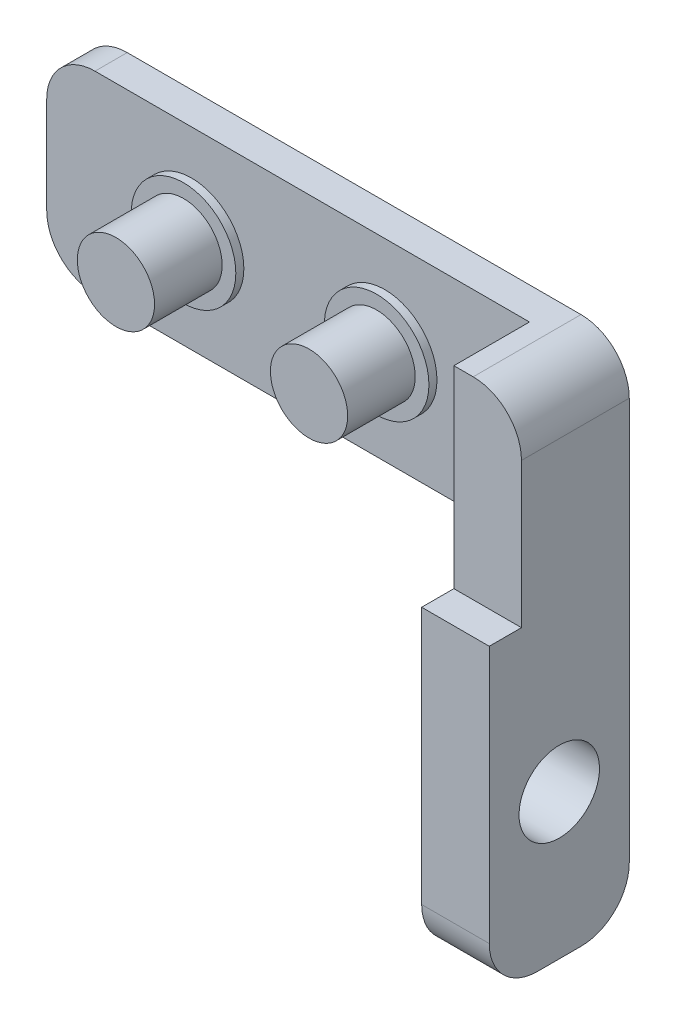
ISO-10303-21;
HEADER;
FILE_DESCRIPTION(('STEP AP214'),'2;1');
FILE_NAME('part.step','',(''),(''),'','','');
FILE_SCHEMA(('AUTOMOTIVE_DESIGN { 1 0 10303 214 1 1 1 1 }'));
ENDSEC;
DATA;
#1=APPLICATION_CONTEXT('core data for automotive mechanical design processes');
#2=APPLICATION_PROTOCOL_DEFINITION('international standard','automotive_design',2000,#1);
#3=PRODUCT_CONTEXT('',#1,'mechanical');
#4=PRODUCT('Part','Part','',(#3));
#5=PRODUCT_RELATED_PRODUCT_CATEGORY('part','',(#4));
#6=PRODUCT_DEFINITION_FORMATION('','',#4);
#7=PRODUCT_DEFINITION_CONTEXT('part definition',#1,'design');
#8=PRODUCT_DEFINITION('design','',#6,#7);
#9=PRODUCT_DEFINITION_SHAPE('','',#8);
#10=(LENGTH_UNIT() NAMED_UNIT(*) SI_UNIT(.MILLI.,.METRE.));
#11=(NAMED_UNIT(*) PLANE_ANGLE_UNIT() SI_UNIT($,.RADIAN.));
#12=(NAMED_UNIT(*) SI_UNIT($,.STERADIAN.) SOLID_ANGLE_UNIT());
#13=UNCERTAINTY_MEASURE_WITH_UNIT(LENGTH_MEASURE(1.E-05),#10,'distance_accuracy_value','');
#14=(GEOMETRIC_REPRESENTATION_CONTEXT(3) GLOBAL_UNCERTAINTY_ASSIGNED_CONTEXT((#13)) GLOBAL_UNIT_ASSIGNED_CONTEXT((#10,
#11,#12)) REPRESENTATION_CONTEXT('',''));
#15=CARTESIAN_POINT('',(0.,0.,0.));
#16=DIRECTION('',(0.,0.,1.));
#17=DIRECTION('',(1.,0.,0.));
#18=AXIS2_PLACEMENT_3D('',#15,#16,#17);
#19=CARTESIAN_POINT('',(21.3907010979574,4.97647058823529,6.7));
#20=DIRECTION('',(0.,0.,-1.));
#21=DIRECTION('',(0.,1.,0.));
#22=AXIS2_PLACEMENT_3D('',#19,#20,#21);
#23=PLANE('',#22);
#24=DIRECTION('',(0.,-1.,0.));
#25=VECTOR('',#24,1.);
#26=CARTESIAN_POINT('',(21.3907010979574,4.97647058823529,6.7));
#27=LINE('',#26,#25);
#28=CARTESIAN_POINT('',(21.3907010979574,1.97647058823529,6.7));
#29=VERTEX_POINT('',#28);
#30=CARTESIAN_POINT('',(21.3907010979574,-7.02352941176471,6.7));
#31=VERTEX_POINT('',#30);
#32=EDGE_CURVE('E151',#29,#31,#27,.T.);
#33=ORIENTED_EDGE('',*,*,#32,.F.);
#34=CARTESIAN_POINT('',(18.3907010979574,1.97647058823529,6.7));
#35=DIRECTION('',(0.,0.,-1.));
#36=DIRECTION('',(0.,1.,0.));
#37=AXIS2_PLACEMENT_3D('',#34,#35,#36);
#38=CIRCLE('',#37,3.);
#39=CARTESIAN_POINT('',(18.3907010979574,4.97647058823529,6.7));
#40=VERTEX_POINT('',#39);
#41=EDGE_CURVE('E235',#29,#40,#38,.F.);
#42=ORIENTED_EDGE('',*,*,#41,.T.);
#43=DIRECTION('',(-1.,0.,0.));
#44=VECTOR('',#43,1.);
#45=CARTESIAN_POINT('',(21.3907010979574,4.97647058823529,6.7));
#46=LINE('',#45,#44);
#47=CARTESIAN_POINT('',(17.1907010979574,4.97647058823529,6.7));
#48=VERTEX_POINT('',#47);
#49=EDGE_CURVE('E174',#40,#48,#46,.T.);
#50=ORIENTED_EDGE('',*,*,#49,.T.);
#51=DIRECTION('',(0.,-1.,0.));
#52=VECTOR('',#51,1.);
#53=CARTESIAN_POINT('',(17.1907010979574,4.97647058823529,6.7));
#54=LINE('',#53,#52);
#55=CARTESIAN_POINT('',(17.1907010979574,-7.02352941176471,6.7));
#56=VERTEX_POINT('',#55);
#57=EDGE_CURVE('E180',#48,#56,#54,.T.);
#58=ORIENTED_EDGE('',*,*,#57,.T.);
#59=DIRECTION('',(-1.,0.,0.));
#60=VECTOR('',#59,1.);
#61=CARTESIAN_POINT('',(17.1907010979574,-7.02352941176471,6.7));
#62=LINE('',#61,#60);
#63=EDGE_CURVE('E164',#31,#56,#62,.T.);
#64=ORIENTED_EDGE('',*,*,#63,.F.);
#65=EDGE_LOOP('',(#33,#42,#50,#58,#64));
#66=FACE_BOUND('',#65,.T.);
#67=ADVANCED_FACE('F34',(#66),#23,.F.);
#68=CARTESIAN_POINT('',(-12.8092989020426,4.97647058823529,2.));
#69=DIRECTION('',(1.,0.,0.));
#70=DIRECTION('',(0.,1.,0.));
#71=AXIS2_PLACEMENT_3D('',#68,#69,#70);
#72=PLANE('',#71);
#73=DIRECTION('',(0.,-1.,0.));
#74=VECTOR('',#73,1.);
#75=CARTESIAN_POINT('',(-12.8092989020426,4.97647058823529,2.));
#76=LINE('',#75,#74);
#77=CARTESIAN_POINT('',(-12.8092989020426,1.97647058823529,2.));
#78=VERTEX_POINT('',#77);
#79=CARTESIAN_POINT('',(-12.8092989020426,-4.02352941176471,2.));
#80=VERTEX_POINT('',#79);
#81=EDGE_CURVE('E209',#78,#80,#76,.T.);
#82=ORIENTED_EDGE('',*,*,#81,.F.);
#83=DIRECTION('',(0.,0.,-1.));
#84=VECTOR('',#83,1.);
#85=CARTESIAN_POINT('',(-12.8092989020426,1.97647058823529,2.));
#86=LINE('',#85,#84);
#87=CARTESIAN_POINT('',(-12.8092989020426,1.97647058823529,0.));
#88=VERTEX_POINT('',#87);
#89=EDGE_CURVE('E252',#78,#88,#86,.T.);
#90=ORIENTED_EDGE('',*,*,#89,.T.);
#91=DIRECTION('',(0.,-1.,0.));
#92=VECTOR('',#91,1.);
#93=CARTESIAN_POINT('',(-12.8092989020426,4.97647058823529,0.));
#94=LINE('',#93,#92);
#95=CARTESIAN_POINT('',(-12.8092989020426,-4.02352941176471,0.));
#96=VERTEX_POINT('',#95);
#97=EDGE_CURVE('E206',#88,#96,#94,.T.);
#98=ORIENTED_EDGE('',*,*,#97,.T.);
#99=DIRECTION('',(0.,0.,-1.));
#100=VECTOR('',#99,1.);
#101=CARTESIAN_POINT('',(-12.8092989020426,-4.02352941176471,2.));
#102=LINE('',#101,#100);
#103=EDGE_CURVE('E250',#96,#80,#102,.F.);
#104=ORIENTED_EDGE('',*,*,#103,.T.);
#105=EDGE_LOOP('',(#82,#90,#98,#104));
#106=FACE_BOUND('',#105,.T.);
#107=ADVANCED_FACE('F292',(#106),#72,.F.);
#108=CARTESIAN_POINT('',(-12.8092989020426,-7.02352941176471,2.));
#109=DIRECTION('',(0.,1.,0.));
#110=DIRECTION('',(0.,0.,1.));
#111=AXIS2_PLACEMENT_3D('',#108,#109,#110);
#112=PLANE('',#111);
#113=DIRECTION('',(1.,0.,0.));
#114=VECTOR('',#113,1.);
#115=CARTESIAN_POINT('',(-12.8092989020426,-7.02352941176471,2.));
#116=LINE('',#115,#114);
#117=CARTESIAN_POINT('',(-9.80929890204256,-7.02352941176471,2.));
#118=VERTEX_POINT('',#117);
#119=CARTESIAN_POINT('',(17.1907010979574,-7.02352941176471,2.));
#120=VERTEX_POINT('',#119);
#121=EDGE_CURVE('E212',#118,#120,#116,.T.);
#122=ORIENTED_EDGE('',*,*,#121,.F.);
#123=DIRECTION('',(0.,0.,-1.));
#124=VECTOR('',#123,1.);
#125=CARTESIAN_POINT('',(-9.80929890204256,-7.02352941176471,2.));
#126=LINE('',#125,#124);
#127=CARTESIAN_POINT('',(-9.80929890204256,-7.02352941176471,0.));
#128=VERTEX_POINT('',#127);
#129=EDGE_CURVE('E259',#118,#128,#126,.T.);
#130=ORIENTED_EDGE('',*,*,#129,.T.);
#131=DIRECTION('',(1.,0.,0.));
#132=VECTOR('',#131,1.);
#133=CARTESIAN_POINT('',(-12.8092989020426,-7.02352941176471,0.));
#134=LINE('',#133,#132);
#135=CARTESIAN_POINT('',(17.1907010979574,-7.02352941176471,0.));
#136=VERTEX_POINT('',#135);
#137=EDGE_CURVE('E223',#128,#136,#134,.T.);
#138=ORIENTED_EDGE('',*,*,#137,.T.);
#139=DIRECTION('',(0.,0.,-1.));
#140=VECTOR('',#139,1.);
#141=CARTESIAN_POINT('',(17.1907010979574,-7.02352941176471,2.));
#142=LINE('',#141,#140);
#143=EDGE_CURVE('E220',#120,#136,#142,.T.);
#144=ORIENTED_EDGE('',*,*,#143,.F.);
#145=EDGE_LOOP('',(#122,#130,#138,#144));
#146=FACE_BOUND('',#145,.T.);
#147=ADVANCED_FACE('F285',(#146),#112,.F.);
#148=CARTESIAN_POINT('',(-12.8092989020426,4.97647058823529,2.));
#149=DIRECTION('',(0.,-1.,0.));
#150=DIRECTION('',(0.,0.,-1.));
#151=AXIS2_PLACEMENT_3D('',#148,#149,#150);
#152=PLANE('',#151);
#153=ORIENTED_EDGE('',*,*,#49,.F.);
#154=DIRECTION('',(0.,0.,1.));
#155=VECTOR('',#154,1.);
#156=CARTESIAN_POINT('',(18.3907010979574,4.97647058823529,2.));
#157=LINE('',#156,#155);
#158=CARTESIAN_POINT('',(18.3907010979574,4.97647058823529,0.));
#159=VERTEX_POINT('',#158);
#160=EDGE_CURVE('E239',#40,#159,#157,.F.);
#161=ORIENTED_EDGE('',*,*,#160,.T.);
#162=DIRECTION('',(-1.,0.,0.));
#163=VECTOR('',#162,1.);
#164=CARTESIAN_POINT('',(-12.8092989020426,4.97647058823529,0.));
#165=LINE('',#164,#163);
#166=CARTESIAN_POINT('',(-9.80929890204256,4.97647058823529,0.));
#167=VERTEX_POINT('',#166);
#168=EDGE_CURVE('E213',#159,#167,#165,.T.);
#169=ORIENTED_EDGE('',*,*,#168,.T.);
#170=DIRECTION('',(0.,0.,-1.));
#171=VECTOR('',#170,1.);
#172=CARTESIAN_POINT('',(-9.80929890204256,4.97647058823529,2.));
#173=LINE('',#172,#171);
#174=CARTESIAN_POINT('',(-9.80929890204256,4.97647058823529,2.));
#175=VERTEX_POINT('',#174);
#176=EDGE_CURVE('E237',#167,#175,#173,.F.);
#177=ORIENTED_EDGE('',*,*,#176,.T.);
#178=DIRECTION('',(-1.,0.,0.));
#179=VECTOR('',#178,1.);
#180=CARTESIAN_POINT('',(-12.8092989020426,4.97647058823529,2.));
#181=LINE('',#180,#179);
#182=CARTESIAN_POINT('',(17.1907010979574,4.97647058823529,2.));
#183=VERTEX_POINT('',#182);
#184=EDGE_CURVE('E217',#183,#175,#181,.T.);
#185=ORIENTED_EDGE('',*,*,#184,.F.);
#186=DIRECTION('',(0.,0.,1.));
#187=VECTOR('',#186,1.);
#188=CARTESIAN_POINT('',(17.1907010979574,4.97647058823529,0.));
#189=LINE('',#188,#187);
#190=EDGE_CURVE('E177',#183,#48,#189,.T.);
#191=ORIENTED_EDGE('',*,*,#190,.T.);
#192=EDGE_LOOP('',(#153,#161,#169,#177,#185,#191));
#193=FACE_BOUND('',#192,.T.);
#194=ADVANCED_FACE('F305',(#193),#152,.F.);
#195=CARTESIAN_POINT('',(0.,0.,2.));
#196=DIRECTION('',(0.,0.,1.));
#197=DIRECTION('',(1.,0.,0.));
#198=AXIS2_PLACEMENT_3D('',#195,#196,#197);
#199=PLANE('',#198);
#200=CARTESIAN_POINT('',(-3.80929890204256,-1.02352941176471,2.));
#201=DIRECTION('',(0.,0.,1.));
#202=DIRECTION('',(1.,0.,0.));
#203=AXIS2_PLACEMENT_3D('',#200,#201,#202);
#204=CIRCLE('',#203,3.25);
#205=CARTESIAN_POINT('',(-0.55929890204256,-1.02352941176471,2.));
#206=VERTEX_POINT('',#205);
#207=EDGE_CURVE('E194',#206,#206,#204,.T.);
#208=ORIENTED_EDGE('',*,*,#207,.F.);
#209=EDGE_LOOP('',(#208));
#210=FACE_BOUND('',#209,.T.);
#211=CARTESIAN_POINT('',(8.19070109795744,-1.02352941176471,2.));
#212=DIRECTION('',(0.,0.,1.));
#213=DIRECTION('',(1.,0.,0.));
#214=AXIS2_PLACEMENT_3D('',#211,#212,#213);
#215=CIRCLE('',#214,3.25);
#216=CARTESIAN_POINT('',(11.4407010979574,-1.02352941176471,2.));
#217=VERTEX_POINT('',#216);
#218=EDGE_CURVE('E200',#217,#217,#215,.T.);
#219=ORIENTED_EDGE('',*,*,#218,.F.);
#220=EDGE_LOOP('',(#219));
#221=FACE_BOUND('',#220,.T.);
#222=ORIENTED_EDGE('',*,*,#184,.T.);
#223=CARTESIAN_POINT('',(-9.80929890204256,1.97647058823529,2.));
#224=DIRECTION('',(0.,0.,1.));
#225=DIRECTION('',(1.,0.,0.));
#226=AXIS2_PLACEMENT_3D('',#223,#224,#225);
#227=CIRCLE('',#226,3.);
#228=EDGE_CURVE('E257',#175,#78,#227,.T.);
#229=ORIENTED_EDGE('',*,*,#228,.T.);
#230=ORIENTED_EDGE('',*,*,#81,.T.);
#231=CARTESIAN_POINT('',(-9.80929890204256,-4.02352941176471,2.));
#232=DIRECTION('',(0.,0.,1.));
#233=DIRECTION('',(1.,0.,0.));
#234=AXIS2_PLACEMENT_3D('',#231,#232,#233);
#235=CIRCLE('',#234,3.);
#236=EDGE_CURVE('E255',#80,#118,#235,.T.);
#237=ORIENTED_EDGE('',*,*,#236,.T.);
#238=ORIENTED_EDGE('',*,*,#121,.T.);
#239=DIRECTION('',(0.,1.,0.));
#240=VECTOR('',#239,1.);
#241=CARTESIAN_POINT('',(17.1907010979574,4.97647058823529,2.));
#242=LINE('',#241,#240);
#243=EDGE_CURVE('E215',#120,#183,#242,.T.);
#244=ORIENTED_EDGE('',*,*,#243,.T.);
#245=EDGE_LOOP('',(#222,#229,#230,#237,#238,#244));
#246=FACE_BOUND('',#245,.T.);
#247=ADVANCED_FACE('F297',(#210,#221,#246),#199,.T.);
#248=CARTESIAN_POINT('',(0.,0.,0.));
#249=DIRECTION('',(0.,0.,1.));
#250=DIRECTION('',(1.,0.,0.));
#251=AXIS2_PLACEMENT_3D('',#248,#249,#250);
#252=PLANE('',#251);
#253=ORIENTED_EDGE('',*,*,#168,.F.);
#254=CARTESIAN_POINT('',(18.3907010979574,1.97647058823529,0.));
#255=DIRECTION('',(0.,0.,1.));
#256=DIRECTION('',(1.,0.,0.));
#257=AXIS2_PLACEMENT_3D('',#254,#255,#256);
#258=CIRCLE('',#257,3.);
#259=CARTESIAN_POINT('',(21.3907010979574,1.97647058823529,0.));
#260=VERTEX_POINT('',#259);
#261=EDGE_CURVE('E248',#159,#260,#258,.F.);
#262=ORIENTED_EDGE('',*,*,#261,.T.);
#263=DIRECTION('',(0.,1.,0.));
#264=VECTOR('',#263,1.);
#265=CARTESIAN_POINT('',(21.3907010979574,4.97647058823529,0.));
#266=LINE('',#265,#264);
#267=CARTESIAN_POINT('',(21.3907010979574,-23.0235294117647,0.));
#268=VERTEX_POINT('',#267);
#269=EDGE_CURVE('E167',#268,#260,#266,.T.);
#270=ORIENTED_EDGE('',*,*,#269,.F.);
#271=DIRECTION('',(-1.,0.,0.));
#272=VECTOR('',#271,1.);
#273=CARTESIAN_POINT('',(0.,-23.0235294117647,0.));
#274=LINE('',#273,#272);
#275=CARTESIAN_POINT('',(17.1907010979574,-23.0235294117647,0.));
#276=VERTEX_POINT('',#275);
#277=EDGE_CURVE('E241',#268,#276,#274,.T.);
#278=ORIENTED_EDGE('',*,*,#277,.T.);
#279=DIRECTION('',(0.,1.,0.));
#280=VECTOR('',#279,1.);
#281=CARTESIAN_POINT('',(17.1907010979574,4.97647058823529,0.));
#282=LINE('',#281,#280);
#283=EDGE_CURVE('E155',#276,#136,#282,.T.);
#284=ORIENTED_EDGE('',*,*,#283,.T.);
#285=ORIENTED_EDGE('',*,*,#137,.F.);
#286=CARTESIAN_POINT('',(-9.80929890204256,-4.02352941176471,0.));
#287=DIRECTION('',(0.,0.,1.));
#288=DIRECTION('',(1.,0.,0.));
#289=AXIS2_PLACEMENT_3D('',#286,#287,#288);
#290=CIRCLE('',#289,3.);
#291=EDGE_CURVE('E244',#128,#96,#290,.F.);
#292=ORIENTED_EDGE('',*,*,#291,.T.);
#293=ORIENTED_EDGE('',*,*,#97,.F.);
#294=CARTESIAN_POINT('',(-9.80929890204256,1.97647058823529,0.));
#295=DIRECTION('',(0.,0.,1.));
#296=DIRECTION('',(1.,0.,0.));
#297=AXIS2_PLACEMENT_3D('',#294,#295,#296);
#298=CIRCLE('',#297,3.);
#299=EDGE_CURVE('E246',#88,#167,#298,.F.);
#300=ORIENTED_EDGE('',*,*,#299,.T.);
#301=EDGE_LOOP('',(#253,#262,#270,#278,#284,#285,#292,#293,#300));
#302=FACE_BOUND('',#301,.T.);
#303=ADVANCED_FACE('F277',(#302),#252,.F.);
#304=CARTESIAN_POINT('',(8.19070109795744,-1.02352941176471,2.5));
#305=DIRECTION('',(0.,0.,-1.));
#306=DIRECTION('',(-1.,0.,0.));
#307=AXIS2_PLACEMENT_3D('',#304,#305,#306);
#308=CYLINDRICAL_SURFACE('',#307,3.25);
#309=CARTESIAN_POINT('',(8.19070109795744,-1.02352941176471,2.5));
#310=DIRECTION('',(0.,0.,1.));
#311=DIRECTION('',(1.,0.,0.));
#312=AXIS2_PLACEMENT_3D('',#309,#310,#311);
#313=CIRCLE('',#312,3.25);
#314=CARTESIAN_POINT('',(11.4407010979574,-1.02352941176471,2.5));
#315=VERTEX_POINT('',#314);
#316=EDGE_CURVE('E203',#315,#315,#313,.T.);
#317=ORIENTED_EDGE('',*,*,#316,.F.);
#318=EDGE_LOOP('',(#317));
#319=FACE_BOUND('',#318,.T.);
#320=ORIENTED_EDGE('',*,*,#218,.T.);
#321=EDGE_LOOP('',(#320));
#322=FACE_BOUND('',#321,.T.);
#323=ADVANCED_FACE('F368',(#319,#322),#308,.T.);
#324=CARTESIAN_POINT('',(8.19070109795744,-1.02352941176471,2.5));
#325=DIRECTION('',(0.,0.,1.));
#326=DIRECTION('',(1.,0.,0.));
#327=AXIS2_PLACEMENT_3D('',#324,#325,#326);
#328=PLANE('',#327);
#329=CARTESIAN_POINT('',(8.19070109795744,-1.02352941176471,2.5));
#330=DIRECTION('',(0.,0.,1.));
#331=DIRECTION('',(1.,0.,0.));
#332=AXIS2_PLACEMENT_3D('',#329,#330,#331);
#333=CIRCLE('',#332,2.4);
#334=CARTESIAN_POINT('',(10.5907010979574,-1.02352941176471,2.5));
#335=VERTEX_POINT('',#334);
#336=EDGE_CURVE('E184',#335,#335,#333,.T.);
#337=ORIENTED_EDGE('',*,*,#336,.F.);
#338=EDGE_LOOP('',(#337));
#339=FACE_BOUND('',#338,.T.);
#340=ORIENTED_EDGE('',*,*,#316,.T.);
#341=EDGE_LOOP('',(#340));
#342=FACE_BOUND('',#341,.T.);
#343=ADVANCED_FACE('F364',(#339,#342),#328,.T.);
#344=CARTESIAN_POINT('',(-3.80929890204256,-1.02352941176471,2.5));
#345=DIRECTION('',(0.,0.,-1.));
#346=DIRECTION('',(-1.,0.,0.));
#347=AXIS2_PLACEMENT_3D('',#344,#345,#346);
#348=CYLINDRICAL_SURFACE('',#347,3.25);
#349=CARTESIAN_POINT('',(-3.80929890204256,-1.02352941176471,2.5));
#350=DIRECTION('',(0.,0.,1.));
#351=DIRECTION('',(1.,0.,0.));
#352=AXIS2_PLACEMENT_3D('',#349,#350,#351);
#353=CIRCLE('',#352,3.25);
#354=CARTESIAN_POINT('',(-0.55929890204256,-1.02352941176471,2.5));
#355=VERTEX_POINT('',#354);
#356=EDGE_CURVE('E197',#355,#355,#353,.T.);
#357=ORIENTED_EDGE('',*,*,#356,.F.);
#358=EDGE_LOOP('',(#357));
#359=FACE_BOUND('',#358,.T.);
#360=ORIENTED_EDGE('',*,*,#207,.T.);
#361=EDGE_LOOP('',(#360));
#362=FACE_BOUND('',#361,.T.);
#363=ADVANCED_FACE('F360',(#359,#362),#348,.T.);
#364=CARTESIAN_POINT('',(-3.80929890204256,-1.02352941176471,2.5));
#365=DIRECTION('',(0.,0.,1.));
#366=DIRECTION('',(1.,0.,0.));
#367=AXIS2_PLACEMENT_3D('',#364,#365,#366);
#368=PLANE('',#367);
#369=CARTESIAN_POINT('',(-3.80929890204256,-1.02352941176471,2.5));
#370=DIRECTION('',(0.,0.,1.));
#371=DIRECTION('',(1.,0.,0.));
#372=AXIS2_PLACEMENT_3D('',#369,#370,#371);
#373=CIRCLE('',#372,2.4);
#374=CARTESIAN_POINT('',(-1.40929890204256,-1.02352941176471,2.5));
#375=VERTEX_POINT('',#374);
#376=EDGE_CURVE('E188',#375,#375,#373,.T.);
#377=ORIENTED_EDGE('',*,*,#376,.F.);
#378=EDGE_LOOP('',(#377));
#379=FACE_BOUND('',#378,.T.);
#380=ORIENTED_EDGE('',*,*,#356,.T.);
#381=EDGE_LOOP('',(#380));
#382=FACE_BOUND('',#381,.T.);
#383=ADVANCED_FACE('F356',(#379,#382),#368,.T.);
#384=CARTESIAN_POINT('',(-3.80929890204256,-1.02352941176471,6.7));
#385=DIRECTION('',(0.,0.,-1.));
#386=DIRECTION('',(-1.,0.,0.));
#387=AXIS2_PLACEMENT_3D('',#384,#385,#386);
#388=CYLINDRICAL_SURFACE('',#387,2.4);
#389=CARTESIAN_POINT('',(-3.80929890204256,-1.02352941176471,6.7));
#390=DIRECTION('',(0.,0.,1.));
#391=DIRECTION('',(1.,0.,0.));
#392=AXIS2_PLACEMENT_3D('',#389,#390,#391);
#393=CIRCLE('',#392,2.4);
#394=CARTESIAN_POINT('',(-1.40929890204256,-1.02352941176471,6.7));
#395=VERTEX_POINT('',#394);
#396=EDGE_CURVE('E191',#395,#395,#393,.T.);
#397=ORIENTED_EDGE('',*,*,#396,.F.);
#398=EDGE_LOOP('',(#397));
#399=FACE_BOUND('',#398,.T.);
#400=ORIENTED_EDGE('',*,*,#376,.T.);
#401=EDGE_LOOP('',(#400));
#402=FACE_BOUND('',#401,.T.);
#403=ADVANCED_FACE('F352',(#399,#402),#388,.T.);
#404=CARTESIAN_POINT('',(-3.80929890204256,-1.02352941176471,6.7));
#405=DIRECTION('',(0.,0.,1.));
#406=DIRECTION('',(1.,0.,0.));
#407=AXIS2_PLACEMENT_3D('',#404,#405,#406);
#408=PLANE('',#407);
#409=ORIENTED_EDGE('',*,*,#396,.T.);
#410=EDGE_LOOP('',(#409));
#411=FACE_BOUND('',#410,.T.);
#412=ADVANCED_FACE('F348',(#411),#408,.T.);
#413=CARTESIAN_POINT('',(8.19070109795744,-1.02352941176471,6.7));
#414=DIRECTION('',(0.,0.,-1.));
#415=DIRECTION('',(-1.,0.,0.));
#416=AXIS2_PLACEMENT_3D('',#413,#414,#415);
#417=CYLINDRICAL_SURFACE('',#416,2.4);
#418=CARTESIAN_POINT('',(8.19070109795744,-1.02352941176471,6.7));
#419=DIRECTION('',(0.,0.,1.));
#420=DIRECTION('',(1.,0.,0.));
#421=AXIS2_PLACEMENT_3D('',#418,#419,#420);
#422=CIRCLE('',#421,2.4);
#423=CARTESIAN_POINT('',(10.5907010979574,-1.02352941176471,6.7));
#424=VERTEX_POINT('',#423);
#425=EDGE_CURVE('E185',#424,#424,#422,.T.);
#426=ORIENTED_EDGE('',*,*,#425,.F.);
#427=EDGE_LOOP('',(#426));
#428=FACE_BOUND('',#427,.T.);
#429=ORIENTED_EDGE('',*,*,#336,.T.);
#430=EDGE_LOOP('',(#429));
#431=FACE_BOUND('',#430,.T.);
#432=ADVANCED_FACE('F335',(#428,#431),#417,.T.);
#433=CARTESIAN_POINT('',(8.19070109795744,-1.02352941176471,6.7));
#434=DIRECTION('',(0.,0.,1.));
#435=DIRECTION('',(1.,0.,0.));
#436=AXIS2_PLACEMENT_3D('',#433,#434,#435);
#437=PLANE('',#436);
#438=ORIENTED_EDGE('',*,*,#425,.T.);
#439=EDGE_LOOP('',(#438));
#440=FACE_BOUND('',#439,.T.);
#441=ADVANCED_FACE('F328',(#440),#437,.T.);
#442=CARTESIAN_POINT('',(17.1907010979574,0.,0.));
#443=DIRECTION('',(-1.,0.,0.));
#444=DIRECTION('',(0.,-1.,0.));
#445=AXIS2_PLACEMENT_3D('',#442,#443,#444);
#446=PLANE('',#445);
#447=CARTESIAN_POINT('',(17.1907010979574,-17.0235294117647,4.35));
#448=DIRECTION('',(-1.,0.,0.));
#449=DIRECTION('',(0.,-1.,0.));
#450=AXIS2_PLACEMENT_3D('',#447,#448,#449);
#451=CIRCLE('',#450,2.5);
#452=CARTESIAN_POINT('',(17.1907010979574,-19.5235294117647,4.35));
#453=VERTEX_POINT('',#452);
#454=EDGE_CURVE('E314',#453,#453,#451,.T.);
#455=ORIENTED_EDGE('',*,*,#454,.F.);
#456=EDGE_LOOP('',(#455));
#457=FACE_BOUND('',#456,.T.);
#458=ORIENTED_EDGE('',*,*,#283,.F.);
#459=CARTESIAN_POINT('',(17.1907010979574,-23.0235294117647,3.));
#460=DIRECTION('',(-1.,0.,0.));
#461=DIRECTION('',(0.,-1.,0.));
#462=AXIS2_PLACEMENT_3D('',#459,#460,#461);
#463=CIRCLE('',#462,3.);
#464=CARTESIAN_POINT('',(17.1907010979574,-26.0235294117647,3.));
#465=VERTEX_POINT('',#464);
#466=EDGE_CURVE('E55',#276,#465,#463,.T.);
#467=ORIENTED_EDGE('',*,*,#466,.T.);
#468=DIRECTION('',(0.,0.,-1.));
#469=VECTOR('',#468,1.);
#470=CARTESIAN_POINT('',(17.1907010979574,-26.0235294117647,0.));
#471=LINE('',#470,#469);
#472=CARTESIAN_POINT('',(17.1907010979574,-26.0235294117647,5.7));
#473=VERTEX_POINT('',#472);
#474=EDGE_CURVE('E169',#473,#465,#471,.T.);
#475=ORIENTED_EDGE('',*,*,#474,.F.);
#476=CARTESIAN_POINT('',(17.1907010979574,-23.0235294117647,5.7));
#477=DIRECTION('',(-1.,0.,0.));
#478=DIRECTION('',(0.,-1.,0.));
#479=AXIS2_PLACEMENT_3D('',#476,#477,#478);
#480=CIRCLE('',#479,3.);
#481=CARTESIAN_POINT('',(17.1907010979574,-23.0235294117647,8.7));
#482=VERTEX_POINT('',#481);
#483=EDGE_CURVE('E49',#473,#482,#480,.T.);
#484=ORIENTED_EDGE('',*,*,#483,.T.);
#485=DIRECTION('',(0.,-1.,0.));
#486=VECTOR('',#485,1.);
#487=CARTESIAN_POINT('',(17.1907010979574,-26.0235294117647,8.7));
#488=LINE('',#487,#486);
#489=CARTESIAN_POINT('',(17.1907010979574,-7.02352941176471,8.7));
#490=VERTEX_POINT('',#489);
#491=EDGE_CURVE('E143',#490,#482,#488,.T.);
#492=ORIENTED_EDGE('',*,*,#491,.F.);
#493=DIRECTION('',(0.,0.,-1.));
#494=VECTOR('',#493,1.);
#495=CARTESIAN_POINT('',(17.1907010979574,-7.02352941176471,8.7));
#496=LINE('',#495,#494);
#497=EDGE_CURVE('E156',#490,#56,#496,.T.);
#498=ORIENTED_EDGE('',*,*,#497,.T.);
#499=ORIENTED_EDGE('',*,*,#57,.F.);
#500=ORIENTED_EDGE('',*,*,#190,.F.);
#501=ORIENTED_EDGE('',*,*,#243,.F.);
#502=ORIENTED_EDGE('',*,*,#143,.T.);
#503=EDGE_LOOP('',(#458,#467,#475,#484,#492,#498,#499,#500,#501,#502));
#504=FACE_BOUND('',#503,.T.);
#505=ADVANCED_FACE('F279',(#457,#504),#446,.T.);
#506=CARTESIAN_POINT('',(21.3907010979574,-26.0235294117647,0.));
#507=DIRECTION('',(0.,1.,0.));
#508=DIRECTION('',(-1.,0.,0.));
#509=AXIS2_PLACEMENT_3D('',#506,#507,#508);
#510=PLANE('',#509);
#511=ORIENTED_EDGE('',*,*,#474,.T.);
#512=DIRECTION('',(-1.,0.,0.));
#513=VECTOR('',#512,1.);
#514=CARTESIAN_POINT('',(21.3907010979574,-26.0235294117647,3.));
#515=LINE('',#514,#513);
#516=CARTESIAN_POINT('',(21.3907010979574,-26.0235294117647,3.));
#517=VERTEX_POINT('',#516);
#518=EDGE_CURVE('E42',#465,#517,#515,.F.);
#519=ORIENTED_EDGE('',*,*,#518,.T.);
#520=DIRECTION('',(0.,0.,-1.));
#521=VECTOR('',#520,1.);
#522=CARTESIAN_POINT('',(21.3907010979574,-26.0235294117647,0.));
#523=LINE('',#522,#521);
#524=CARTESIAN_POINT('',(21.3907010979574,-26.0235294117647,5.7));
#525=VERTEX_POINT('',#524);
#526=EDGE_CURVE('E171',#525,#517,#523,.T.);
#527=ORIENTED_EDGE('',*,*,#526,.F.);
#528=DIRECTION('',(1.,0.,0.));
#529=VECTOR('',#528,1.);
#530=CARTESIAN_POINT('',(21.3907010979574,-26.0235294117647,5.7));
#531=LINE('',#530,#529);
#532=EDGE_CURVE('E264',#525,#473,#531,.F.);
#533=ORIENTED_EDGE('',*,*,#532,.T.);
#534=EDGE_LOOP('',(#511,#519,#527,#533));
#535=FACE_BOUND('',#534,.T.);
#536=ADVANCED_FACE('F268',(#535),#510,.F.);
#537=CARTESIAN_POINT('',(21.3907010979574,0.,0.));
#538=DIRECTION('',(-1.,0.,0.));
#539=DIRECTION('',(0.,-1.,0.));
#540=AXIS2_PLACEMENT_3D('',#537,#538,#539);
#541=PLANE('',#540);
#542=CARTESIAN_POINT('',(21.3907010979574,-17.0235294117647,4.35));
#543=DIRECTION('',(-1.,0.,0.));
#544=DIRECTION('',(0.,-1.,0.));
#545=AXIS2_PLACEMENT_3D('',#542,#543,#544);
#546=CIRCLE('',#545,2.5);
#547=CARTESIAN_POINT('',(21.3907010979574,-19.5235294117647,4.35));
#548=VERTEX_POINT('',#547);
#549=EDGE_CURVE('E165',#548,#548,#546,.T.);
#550=ORIENTED_EDGE('',*,*,#549,.T.);
#551=EDGE_LOOP('',(#550));
#552=FACE_BOUND('',#551,.T.);
#553=ORIENTED_EDGE('',*,*,#269,.T.);
#554=DIRECTION('',(0.,0.,1.));
#555=VECTOR('',#554,1.);
#556=CARTESIAN_POINT('',(21.3907010979574,1.97647058823529,0.));
#557=LINE('',#556,#555);
#558=EDGE_CURVE('E233',#260,#29,#557,.T.);
#559=ORIENTED_EDGE('',*,*,#558,.T.);
#560=ORIENTED_EDGE('',*,*,#32,.T.);
#561=DIRECTION('',(0.,0.,-1.));
#562=VECTOR('',#561,1.);
#563=CARTESIAN_POINT('',(21.3907010979574,-7.02352941176471,8.7));
#564=LINE('',#563,#562);
#565=CARTESIAN_POINT('',(21.3907010979574,-7.02352941176471,8.7));
#566=VERTEX_POINT('',#565);
#567=EDGE_CURVE('E146',#566,#31,#564,.T.);
#568=ORIENTED_EDGE('',*,*,#567,.F.);
#569=DIRECTION('',(0.,1.,0.));
#570=VECTOR('',#569,1.);
#571=CARTESIAN_POINT('',(21.3907010979574,-26.0235294117647,8.7));
#572=LINE('',#571,#570);
#573=CARTESIAN_POINT('',(21.3907010979574,-23.0235294117647,8.7));
#574=VERTEX_POINT('',#573);
#575=EDGE_CURVE('E135',#574,#566,#572,.T.);
#576=ORIENTED_EDGE('',*,*,#575,.F.);
#577=CARTESIAN_POINT('',(21.3907010979574,-23.0235294117647,5.7));
#578=DIRECTION('',(-1.,0.,0.));
#579=DIRECTION('',(0.,-1.,0.));
#580=AXIS2_PLACEMENT_3D('',#577,#578,#579);
#581=CIRCLE('',#580,3.);
#582=EDGE_CURVE('E229',#574,#525,#581,.F.);
#583=ORIENTED_EDGE('',*,*,#582,.T.);
#584=ORIENTED_EDGE('',*,*,#526,.T.);
#585=CARTESIAN_POINT('',(21.3907010979574,-23.0235294117647,3.));
#586=DIRECTION('',(-1.,0.,0.));
#587=DIRECTION('',(0.,-1.,0.));
#588=AXIS2_PLACEMENT_3D('',#585,#586,#587);
#589=CIRCLE('',#588,3.);
#590=EDGE_CURVE('E231',#517,#268,#589,.F.);
#591=ORIENTED_EDGE('',*,*,#590,.T.);
#592=EDGE_LOOP('',(#553,#559,#560,#568,#576,#583,#584,#591));
#593=FACE_BOUND('',#592,.T.);
#594=ADVANCED_FACE('F148',(#552,#593),#541,.F.);
#595=CARTESIAN_POINT('',(17.1907010979574,-7.02352941176471,8.7));
#596=DIRECTION('',(0.,-1.,0.));
#597=DIRECTION('',(0.,0.,-1.));
#598=AXIS2_PLACEMENT_3D('',#595,#596,#597);
#599=PLANE('',#598);
#600=ORIENTED_EDGE('',*,*,#63,.T.);
#601=ORIENTED_EDGE('',*,*,#497,.F.);
#602=DIRECTION('',(-1.,0.,0.));
#603=VECTOR('',#602,1.);
#604=CARTESIAN_POINT('',(17.1907010979574,-7.02352941176471,8.7));
#605=LINE('',#604,#603);
#606=EDGE_CURVE('E139',#566,#490,#605,.T.);
#607=ORIENTED_EDGE('',*,*,#606,.F.);
#608=ORIENTED_EDGE('',*,*,#567,.T.);
#609=EDGE_LOOP('',(#600,#601,#607,#608));
#610=FACE_BOUND('',#609,.T.);
#611=ADVANCED_FACE('F158',(#610),#599,.F.);
#612=CARTESIAN_POINT('',(0.,0.,8.7));
#613=DIRECTION('',(0.,0.,-1.));
#614=DIRECTION('',(-1.,0.,0.));
#615=AXIS2_PLACEMENT_3D('',#612,#613,#614);
#616=PLANE('',#615);
#617=ORIENTED_EDGE('',*,*,#491,.T.);
#618=DIRECTION('',(1.,0.,0.));
#619=VECTOR('',#618,1.);
#620=CARTESIAN_POINT('',(0.,-23.0235294117647,8.7));
#621=LINE('',#620,#619);
#622=EDGE_CURVE('E11',#482,#574,#621,.T.);
#623=ORIENTED_EDGE('',*,*,#622,.T.);
#624=ORIENTED_EDGE('',*,*,#575,.T.);
#625=ORIENTED_EDGE('',*,*,#606,.T.);
#626=EDGE_LOOP('',(#617,#623,#624,#625));
#627=FACE_BOUND('',#626,.T.);
#628=ADVANCED_FACE('F137',(#627),#616,.F.);
#629=CARTESIAN_POINT('',(21.3907010979574,-17.0235294117647,4.35));
#630=DIRECTION('',(-1.,0.,0.));
#631=DIRECTION('',(0.,-1.,0.));
#632=AXIS2_PLACEMENT_3D('',#629,#630,#631);
#633=CYLINDRICAL_SURFACE('',#632,2.5);
#634=ORIENTED_EDGE('',*,*,#549,.F.);
#635=EDGE_LOOP('',(#634));
#636=FACE_BOUND('',#635,.T.);
#637=ORIENTED_EDGE('',*,*,#454,.T.);
#638=EDGE_LOOP('',(#637));
#639=FACE_BOUND('',#638,.T.);
#640=ADVANCED_FACE('F321',(#636,#639),#633,.F.);
#641=CARTESIAN_POINT('',(18.3907010979574,1.97647058823529,0.));
#642=DIRECTION('',(0.,0.,1.));
#643=DIRECTION('',(1.,0.,0.));
#644=AXIS2_PLACEMENT_3D('',#641,#642,#643);
#645=CYLINDRICAL_SURFACE('',#644,3.);
#646=ORIENTED_EDGE('',*,*,#261,.F.);
#647=ORIENTED_EDGE('',*,*,#160,.F.);
#648=ORIENTED_EDGE('',*,*,#41,.F.);
#649=ORIENTED_EDGE('',*,*,#558,.F.);
#650=EDGE_LOOP('',(#646,#647,#648,#649));
#651=FACE_BOUND('',#650,.T.);
#652=ADVANCED_FACE('F309',(#651),#645,.T.);
#653=CARTESIAN_POINT('',(-9.80929890204256,1.97647058823529,2.));
#654=DIRECTION('',(0.,0.,-1.));
#655=DIRECTION('',(-1.,0.,0.));
#656=AXIS2_PLACEMENT_3D('',#653,#654,#655);
#657=CYLINDRICAL_SURFACE('',#656,3.);
#658=ORIENTED_EDGE('',*,*,#228,.F.);
#659=ORIENTED_EDGE('',*,*,#176,.F.);
#660=ORIENTED_EDGE('',*,*,#299,.F.);
#661=ORIENTED_EDGE('',*,*,#89,.F.);
#662=EDGE_LOOP('',(#658,#659,#660,#661));
#663=FACE_BOUND('',#662,.T.);
#664=ADVANCED_FACE('F300',(#663),#657,.T.);
#665=CARTESIAN_POINT('',(-9.80929890204256,-4.02352941176471,2.));
#666=DIRECTION('',(0.,0.,-1.));
#667=DIRECTION('',(-1.,0.,0.));
#668=AXIS2_PLACEMENT_3D('',#665,#666,#667);
#669=CYLINDRICAL_SURFACE('',#668,3.);
#670=ORIENTED_EDGE('',*,*,#236,.F.);
#671=ORIENTED_EDGE('',*,*,#103,.F.);
#672=ORIENTED_EDGE('',*,*,#291,.F.);
#673=ORIENTED_EDGE('',*,*,#129,.F.);
#674=EDGE_LOOP('',(#670,#671,#672,#673));
#675=FACE_BOUND('',#674,.T.);
#676=ADVANCED_FACE('F295',(#675),#669,.T.);
#677=CARTESIAN_POINT('',(0.,-23.0235294117647,3.));
#678=DIRECTION('',(-1.,0.,0.));
#679=DIRECTION('',(0.,-1.,0.));
#680=AXIS2_PLACEMENT_3D('',#677,#678,#679);
#681=CYLINDRICAL_SURFACE('',#680,3.);
#682=ORIENTED_EDGE('',*,*,#590,.F.);
#683=ORIENTED_EDGE('',*,*,#518,.F.);
#684=ORIENTED_EDGE('',*,*,#466,.F.);
#685=ORIENTED_EDGE('',*,*,#277,.F.);
#686=EDGE_LOOP('',(#682,#683,#684,#685));
#687=FACE_BOUND('',#686,.T.);
#688=ADVANCED_FACE('F274',(#687),#681,.T.);
#689=CARTESIAN_POINT('',(0.,-23.0235294117647,5.7));
#690=DIRECTION('',(1.,0.,0.));
#691=DIRECTION('',(0.,1.,0.));
#692=AXIS2_PLACEMENT_3D('',#689,#690,#691);
#693=CYLINDRICAL_SURFACE('',#692,3.);
#694=ORIENTED_EDGE('',*,*,#483,.F.);
#695=ORIENTED_EDGE('',*,*,#532,.F.);
#696=ORIENTED_EDGE('',*,*,#582,.F.);
#697=ORIENTED_EDGE('',*,*,#622,.F.);
#698=EDGE_LOOP('',(#694,#695,#696,#697));
#699=FACE_BOUND('',#698,.T.);
#700=ADVANCED_FACE('F36',(#699),#693,.T.);
#701=CLOSED_SHELL('',(#67,#107,#147,#194,#247,#303,#323,#343,#363,#383,#403,#412,#432,#441,#505,
#536,#594,#611,#628,#640,#652,#664,#676,#688,#700));
#702=MANIFOLD_SOLID_BREP('B2',#701);
#703=ADVANCED_BREP_SHAPE_REPRESENTATION('',(#18,#702),#14);
#704=SHAPE_DEFINITION_REPRESENTATION(#9,#703);
ENDSEC;
END-ISO-10303-21;
